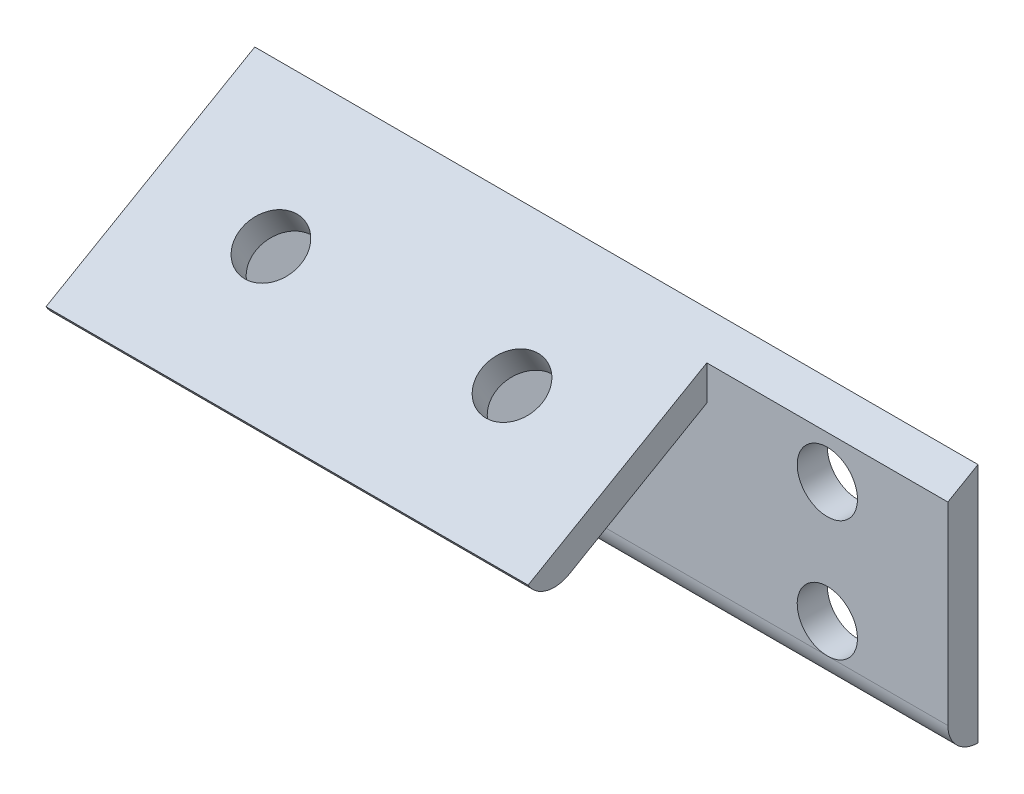
ISO-10303-21;
HEADER;
FILE_DESCRIPTION(('STEP AP214'),'2;1');
FILE_NAME('part.step','',(''),(''),'','','');
FILE_SCHEMA(('AUTOMOTIVE_DESIGN { 1 0 10303 214 1 1 1 1 }'));
ENDSEC;
DATA;
#1=APPLICATION_CONTEXT('core data for automotive mechanical design processes');
#2=APPLICATION_PROTOCOL_DEFINITION('international standard','automotive_design',2000,#1);
#3=PRODUCT_CONTEXT('',#1,'mechanical');
#4=PRODUCT('Part','Part','',(#3));
#5=PRODUCT_RELATED_PRODUCT_CATEGORY('part','',(#4));
#6=PRODUCT_DEFINITION_FORMATION('','',#4);
#7=PRODUCT_DEFINITION_CONTEXT('part definition',#1,'design');
#8=PRODUCT_DEFINITION('design','',#6,#7);
#9=PRODUCT_DEFINITION_SHAPE('','',#8);
#10=(LENGTH_UNIT() NAMED_UNIT(*) SI_UNIT(.MILLI.,.METRE.));
#11=(NAMED_UNIT(*) PLANE_ANGLE_UNIT() SI_UNIT($,.RADIAN.));
#12=(NAMED_UNIT(*) SI_UNIT($,.STERADIAN.) SOLID_ANGLE_UNIT());
#13=UNCERTAINTY_MEASURE_WITH_UNIT(LENGTH_MEASURE(1.E-05),#10,'distance_accuracy_value','');
#14=(GEOMETRIC_REPRESENTATION_CONTEXT(3) GLOBAL_UNCERTAINTY_ASSIGNED_CONTEXT((#13)) GLOBAL_UNIT_ASSIGNED_CONTEXT((#10,
#11,#12)) REPRESENTATION_CONTEXT('',''));
#15=CARTESIAN_POINT('',(0.,0.,0.));
#16=DIRECTION('',(0.,0.,1.));
#17=DIRECTION('',(1.,0.,0.));
#18=AXIS2_PLACEMENT_3D('',#15,#16,#17);
#19=CARTESIAN_POINT('',(76.2,0.,0.));
#20=DIRECTION('',(0.,-0.86602540378444,-0.499999999999998));
#21=DIRECTION('',(0.,0.499999999999998,-0.86602540378444));
#22=AXIS2_PLACEMENT_3D('',#19,#20,#21);
#23=PLANE('',#22);
#24=CARTESIAN_POINT('',(38.1,-6.34999999999997,10.9985226280624));
#25=DIRECTION('',(0.,0.86602540378444,0.499999999999998));
#26=DIRECTION('',(0.,-0.499999999999998,0.86602540378444));
#27=AXIS2_PLACEMENT_3D('',#24,#25,#26);
#28=CIRCLE('',#27,3.17499999999998);
#29=CARTESIAN_POINT('',(38.1,-7.93749999999996,13.748153285078));
#30=VERTEX_POINT('',#29);
#31=EDGE_CURVE('E197',#30,#30,#28,.T.);
#32=ORIENTED_EDGE('',*,*,#31,.F.);
#33=EDGE_LOOP('',(#32));
#34=FACE_BOUND('',#33,.T.);
#35=DIRECTION('',(-1.,0.,0.));
#36=VECTOR('',#35,1.);
#37=CARTESIAN_POINT('',(76.2,-12.6999999999999,21.9970452561248));
#38=LINE('',#37,#36);
#39=CARTESIAN_POINT('',(50.8,-12.6999999999999,21.9970452561248));
#40=VERTEX_POINT('',#39);
#41=CARTESIAN_POINT('',(0.,-12.6999999999999,21.9970452561248));
#42=VERTEX_POINT('',#41);
#43=EDGE_CURVE('E11',#40,#42,#38,.T.);
#44=ORIENTED_EDGE('',*,*,#43,.F.);
#45=DIRECTION('',(0.,-0.499999999999998,0.86602540378444));
#46=VECTOR('',#45,1.);
#47=CARTESIAN_POINT('',(50.8,-7.72506532850775,13.3802056407642));
#48=LINE('',#47,#46);
#49=CARTESIAN_POINT('',(50.8,-1.83308710467706,3.17499999999999));
#50=VERTEX_POINT('',#49);
#51=EDGE_CURVE('E117',#50,#40,#48,.T.);
#52=ORIENTED_EDGE('',*,*,#51,.F.);
#53=DIRECTION('',(-1.,0.,0.));
#54=VECTOR('',#53,1.);
#55=CARTESIAN_POINT('',(50.8,-1.83308710467705,3.17499999999999));
#56=LINE('',#55,#54);
#57=CARTESIAN_POINT('',(76.2,-1.83308710467706,3.175));
#58=VERTEX_POINT('',#57);
#59=EDGE_CURVE('E105',#58,#50,#56,.T.);
#60=ORIENTED_EDGE('',*,*,#59,.F.);
#61=DIRECTION('',(0.,-0.499999999999998,0.86602540378444));
#62=VECTOR('',#61,1.);
#63=CARTESIAN_POINT('',(76.2,0.,0.));
#64=LINE('',#63,#62);
#65=CARTESIAN_POINT('',(76.2,0.,0.));
#66=VERTEX_POINT('',#65);
#67=EDGE_CURVE('E111',#66,#58,#64,.T.);
#68=ORIENTED_EDGE('',*,*,#67,.F.);
#69=DIRECTION('',(-1.,0.,0.));
#70=VECTOR('',#69,1.);
#71=CARTESIAN_POINT('',(76.2,0.,0.));
#72=LINE('',#71,#70);
#73=CARTESIAN_POINT('',(0.,0.,0.));
#74=VERTEX_POINT('',#73);
#75=EDGE_CURVE('E130',#66,#74,#72,.T.);
#76=ORIENTED_EDGE('',*,*,#75,.T.);
#77=DIRECTION('',(0.,-0.499999999999998,0.86602540378444));
#78=VECTOR('',#77,1.);
#79=CARTESIAN_POINT('',(0.,0.,0.));
#80=LINE('',#79,#78);
#81=EDGE_CURVE('E131',#74,#42,#80,.T.);
#82=ORIENTED_EDGE('',*,*,#81,.T.);
#83=EDGE_LOOP('',(#44,#52,#60,#68,#76,#82));
#84=FACE_BOUND('',#83,.T.);
#85=CARTESIAN_POINT('',(12.7,-6.34999999999997,10.9985226280624));
#86=DIRECTION('',(0.,0.86602540378444,0.499999999999998));
#87=DIRECTION('',(0.,-0.499999999999998,0.86602540378444));
#88=AXIS2_PLACEMENT_3D('',#85,#86,#87);
#89=CIRCLE('',#88,3.17499999999999);
#90=CARTESIAN_POINT('',(12.7,-7.93749999999996,13.748153285078));
#91=VERTEX_POINT('',#90);
#92=EDGE_CURVE('E206',#91,#91,#89,.T.);
#93=ORIENTED_EDGE('',*,*,#92,.F.);
#94=EDGE_LOOP('',(#93));
#95=FACE_BOUND('',#94,.T.);
#96=ADVANCED_FACE('F35',(#34,#84,#95),#23,.F.);
#97=CARTESIAN_POINT('',(76.2,-5.49926131403117,3.175));
#98=DIRECTION('',(0.,0.,-1.));
#99=DIRECTION('',(0.,1.,0.));
#100=AXIS2_PLACEMENT_3D('',#97,#98,#99);
#101=PLANE('',#100);
#102=DIRECTION('',(-1.,0.,0.));
#103=VECTOR('',#102,1.);
#104=CARTESIAN_POINT('',(76.2,-22.225,3.175));
#105=LINE('',#104,#103);
#106=CARTESIAN_POINT('',(63.5,-22.225,3.175));
#107=VERTEX_POINT('',#106);
#108=CARTESIAN_POINT('',(0.,-22.225,3.175));
#109=VERTEX_POINT('',#108);
#110=EDGE_CURVE('E147',#107,#109,#105,.T.);
#111=ORIENTED_EDGE('',*,*,#110,.F.);
#112=CARTESIAN_POINT('',(63.5,-19.05,3.175));
#113=DIRECTION('',(0.,0.,1.));
#114=DIRECTION('',(1.,0.,0.));
#115=AXIS2_PLACEMENT_3D('',#112,#113,#114);
#116=CIRCLE('',#115,3.17499999999998);
#117=EDGE_CURVE('E47',#107,#107,#116,.T.);
#118=ORIENTED_EDGE('',*,*,#117,.F.);
#119=CARTESIAN_POINT('',(76.2,-22.225,3.175));
#120=VERTEX_POINT('',#119);
#121=EDGE_CURVE('E108',#120,#107,#105,.T.);
#122=ORIENTED_EDGE('',*,*,#121,.F.);
#123=DIRECTION('',(0.,-1.,0.));
#124=VECTOR('',#123,1.);
#125=CARTESIAN_POINT('',(76.2,-5.49926131403117,3.175));
#126=LINE('',#125,#124);
#127=EDGE_CURVE('E84',#58,#120,#126,.T.);
#128=ORIENTED_EDGE('',*,*,#127,.F.);
#129=ORIENTED_EDGE('',*,*,#59,.T.);
#130=DIRECTION('',(0.,1.,0.));
#131=VECTOR('',#130,1.);
#132=CARTESIAN_POINT('',(50.8,-25.401,3.17499999999999));
#133=LINE('',#132,#131);
#134=CARTESIAN_POINT('',(50.8,-5.49926131403117,3.17499999999999));
#135=VERTEX_POINT('',#134);
#136=EDGE_CURVE('E125',#135,#50,#133,.T.);
#137=ORIENTED_EDGE('',*,*,#136,.F.);
#138=DIRECTION('',(-1.,0.,0.));
#139=VECTOR('',#138,1.);
#140=CARTESIAN_POINT('',(76.2,-5.49926131403117,3.175));
#141=LINE('',#140,#139);
#142=CARTESIAN_POINT('',(0.,-5.49926131403117,3.175));
#143=VERTEX_POINT('',#142);
#144=EDGE_CURVE('E149',#135,#143,#141,.T.);
#145=ORIENTED_EDGE('',*,*,#144,.T.);
#146=DIRECTION('',(0.,-1.,0.));
#147=VECTOR('',#146,1.);
#148=CARTESIAN_POINT('',(0.,-5.49926131403117,3.175));
#149=LINE('',#148,#147);
#150=EDGE_CURVE('E140',#143,#109,#149,.T.);
#151=ORIENTED_EDGE('',*,*,#150,.T.);
#152=EDGE_LOOP('',(#111,#118,#122,#128,#129,#137,#145,#151));
#153=FACE_BOUND('',#152,.T.);
#154=CARTESIAN_POINT('',(63.5,-6.35,3.175));
#155=DIRECTION('',(0.,0.,1.));
#156=DIRECTION('',(1.,0.,0.));
#157=AXIS2_PLACEMENT_3D('',#154,#155,#156);
#158=CIRCLE('',#157,3.17499999999998);
#159=CARTESIAN_POINT('',(66.675,-6.35,3.175));
#160=VERTEX_POINT('',#159);
#161=EDGE_CURVE('E203',#160,#160,#158,.T.);
#162=ORIENTED_EDGE('',*,*,#161,.F.);
#163=EDGE_LOOP('',(#162));
#164=FACE_BOUND('',#163,.T.);
#165=ADVANCED_FACE('F103',(#153,#164),#101,.F.);
#166=CARTESIAN_POINT('',(76.2,-11.1125,19.2474145991092));
#167=DIRECTION('',(-1.,0.,0.));
#168=DIRECTION('',(0.,0.,1.));
#169=AXIS2_PLACEMENT_3D('',#166,#167,#168);
#170=CYLINDRICAL_SURFACE('',#169,3.175);
#171=DIRECTION('',(-1.,0.,0.));
#172=VECTOR('',#171,1.);
#173=CARTESIAN_POINT('',(76.2,-13.8621306570156,17.6599145991092));
#174=LINE('',#173,#172);
#175=CARTESIAN_POINT('',(50.8,-13.8621306570156,17.6599145991092));
#176=VERTEX_POINT('',#175);
#177=CARTESIAN_POINT('',(0.,-13.8621306570156,17.6599145991092));
#178=VERTEX_POINT('',#177);
#179=EDGE_CURVE('E42',#176,#178,#174,.T.);
#180=ORIENTED_EDGE('',*,*,#179,.F.);
#181=CARTESIAN_POINT('',(50.8,-11.1125,19.2474145991092));
#182=DIRECTION('',(-1.,0.,0.));
#183=DIRECTION('',(0.,0.,1.));
#184=AXIS2_PLACEMENT_3D('',#181,#182,#183);
#185=CIRCLE('',#184,3.175);
#186=EDGE_CURVE('E118',#40,#176,#185,.F.);
#187=ORIENTED_EDGE('',*,*,#186,.F.);
#188=ORIENTED_EDGE('',*,*,#43,.T.);
#189=CARTESIAN_POINT('',(0.,-11.1125,19.2474145991092));
#190=DIRECTION('',(1.,0.,0.));
#191=DIRECTION('',(0.,0.,-1.));
#192=AXIS2_PLACEMENT_3D('',#189,#190,#191);
#193=CIRCLE('',#192,3.175);
#194=EDGE_CURVE('E134',#42,#178,#193,.T.);
#195=ORIENTED_EDGE('',*,*,#194,.T.);
#196=EDGE_LOOP('',(#180,#187,#188,#195));
#197=FACE_BOUND('',#196,.T.);
#198=ADVANCED_FACE('F162',(#197),#170,.T.);
#199=CARTESIAN_POINT('',(76.2,-13.8621306570156,17.6599145991092));
#200=DIRECTION('',(0.,0.866025403784439,0.499999999999999));
#201=DIRECTION('',(0.,-0.499999999999999,0.86602540378444));
#202=AXIS2_PLACEMENT_3D('',#199,#200,#201);
#203=PLANE('',#202);
#204=CARTESIAN_POINT('',(12.7,-9.09963065701557,9.41102262806239));
#205=DIRECTION('',(0.,0.866025403784439,0.499999999999999));
#206=DIRECTION('',(0.,-0.499999999999999,0.86602540378444));
#207=AXIS2_PLACEMENT_3D('',#204,#205,#206);
#208=CIRCLE('',#207,3.17499999999999);
#209=CARTESIAN_POINT('',(12.7,-10.6871306570156,12.160653285078));
#210=VERTEX_POINT('',#209);
#211=EDGE_CURVE('E200',#210,#210,#208,.T.);
#212=ORIENTED_EDGE('',*,*,#211,.T.);
#213=EDGE_LOOP('',(#212));
#214=FACE_BOUND('',#213,.T.);
#215=CARTESIAN_POINT('',(38.1,-9.09963065701557,9.41102262806239));
#216=DIRECTION('',(0.,0.866025403784439,0.499999999999999));
#217=DIRECTION('',(0.,-0.499999999999999,0.86602540378444));
#218=AXIS2_PLACEMENT_3D('',#215,#216,#217);
#219=CIRCLE('',#218,3.17499999999999);
#220=CARTESIAN_POINT('',(38.1,-10.6871306570156,12.160653285078));
#221=VERTEX_POINT('',#220);
#222=EDGE_CURVE('E199',#221,#221,#219,.T.);
#223=ORIENTED_EDGE('',*,*,#222,.T.);
#224=EDGE_LOOP('',(#223));
#225=FACE_BOUND('',#224,.T.);
#226=ORIENTED_EDGE('',*,*,#144,.F.);
#227=DIRECTION('',(0.,0.499999999999999,-0.86602540378444));
#228=VECTOR('',#227,1.);
#229=CARTESIAN_POINT('',(50.8,-10.4746959855233,11.7927056407643));
#230=LINE('',#229,#228);
#231=EDGE_CURVE('E158',#176,#135,#230,.T.);
#232=ORIENTED_EDGE('',*,*,#231,.F.);
#233=ORIENTED_EDGE('',*,*,#179,.T.);
#234=DIRECTION('',(0.,0.499999999999999,-0.866025403784439));
#235=VECTOR('',#234,1.);
#236=CARTESIAN_POINT('',(0.,-13.8621306570156,17.6599145991092));
#237=LINE('',#236,#235);
#238=EDGE_CURVE('E137',#178,#143,#237,.T.);
#239=ORIENTED_EDGE('',*,*,#238,.T.);
#240=EDGE_LOOP('',(#226,#232,#233,#239));
#241=FACE_BOUND('',#240,.T.);
#242=ADVANCED_FACE('F154',(#214,#225,#241),#203,.F.);
#243=CARTESIAN_POINT('',(76.2,-22.225,0.));
#244=DIRECTION('',(-1.,0.,0.));
#245=DIRECTION('',(0.,0.,1.));
#246=AXIS2_PLACEMENT_3D('',#243,#244,#245);
#247=CYLINDRICAL_SURFACE('',#246,3.175);
#248=CARTESIAN_POINT('',(0.,-22.225,0.));
#249=DIRECTION('',(1.,0.,0.));
#250=DIRECTION('',(0.,0.,1.));
#251=AXIS2_PLACEMENT_3D('',#248,#249,#250);
#252=CIRCLE('',#251,3.175);
#253=CARTESIAN_POINT('',(0.,-25.4,0.));
#254=VERTEX_POINT('',#253);
#255=EDGE_CURVE('E122',#109,#254,#252,.T.);
#256=ORIENTED_EDGE('',*,*,#255,.T.);
#257=DIRECTION('',(-1.,0.,0.));
#258=VECTOR('',#257,1.);
#259=CARTESIAN_POINT('',(76.2,-25.4,0.));
#260=LINE('',#259,#258);
#261=CARTESIAN_POINT('',(76.2,-25.4,0.));
#262=VERTEX_POINT('',#261);
#263=EDGE_CURVE('E145',#262,#254,#260,.T.);
#264=ORIENTED_EDGE('',*,*,#263,.F.);
#265=CARTESIAN_POINT('',(76.2,-22.225,0.));
#266=DIRECTION('',(1.,0.,0.));
#267=DIRECTION('',(0.,0.,1.));
#268=AXIS2_PLACEMENT_3D('',#265,#266,#267);
#269=CIRCLE('',#268,3.175);
#270=EDGE_CURVE('E110',#120,#262,#269,.T.);
#271=ORIENTED_EDGE('',*,*,#270,.F.);
#272=ORIENTED_EDGE('',*,*,#121,.T.);
#273=ORIENTED_EDGE('',*,*,#110,.T.);
#274=EDGE_LOOP('',(#256,#264,#271,#272,#273));
#275=FACE_BOUND('',#274,.T.);
#276=ADVANCED_FACE('F178',(#275),#247,.T.);
#277=CARTESIAN_POINT('',(76.2,0.,0.));
#278=DIRECTION('',(0.,0.,1.));
#279=DIRECTION('',(0.,-1.,0.));
#280=AXIS2_PLACEMENT_3D('',#277,#278,#279);
#281=PLANE('',#280);
#282=CARTESIAN_POINT('',(63.5,-6.35,0.));
#283=DIRECTION('',(0.,0.,1.));
#284=DIRECTION('',(0.,-1.,0.));
#285=AXIS2_PLACEMENT_3D('',#282,#283,#284);
#286=CIRCLE('',#285,3.17499999999999);
#287=CARTESIAN_POINT('',(63.5,-9.52499999999999,0.));
#288=VERTEX_POINT('',#287);
#289=EDGE_CURVE('E212',#288,#288,#286,.T.);
#290=ORIENTED_EDGE('',*,*,#289,.T.);
#291=EDGE_LOOP('',(#290));
#292=FACE_BOUND('',#291,.T.);
#293=CARTESIAN_POINT('',(63.5,-19.05,0.));
#294=DIRECTION('',(0.,0.,1.));
#295=DIRECTION('',(0.,-1.,0.));
#296=AXIS2_PLACEMENT_3D('',#293,#294,#295);
#297=CIRCLE('',#296,3.17499999999999);
#298=CARTESIAN_POINT('',(63.5,-22.225,0.));
#299=VERTEX_POINT('',#298);
#300=EDGE_CURVE('E169',#299,#299,#297,.T.);
#301=ORIENTED_EDGE('',*,*,#300,.T.);
#302=EDGE_LOOP('',(#301));
#303=FACE_BOUND('',#302,.T.);
#304=DIRECTION('',(0.,1.,0.));
#305=VECTOR('',#304,1.);
#306=CARTESIAN_POINT('',(0.,0.,0.));
#307=LINE('',#306,#305);
#308=EDGE_CURVE('E80',#254,#74,#307,.T.);
#309=ORIENTED_EDGE('',*,*,#308,.T.);
#310=ORIENTED_EDGE('',*,*,#75,.F.);
#311=DIRECTION('',(0.,1.,0.));
#312=VECTOR('',#311,1.);
#313=CARTESIAN_POINT('',(76.2,0.,0.));
#314=LINE('',#313,#312);
#315=EDGE_CURVE('E55',#262,#66,#314,.T.);
#316=ORIENTED_EDGE('',*,*,#315,.F.);
#317=ORIENTED_EDGE('',*,*,#263,.T.);
#318=EDGE_LOOP('',(#309,#310,#316,#317));
#319=FACE_BOUND('',#318,.T.);
#320=ADVANCED_FACE('F175',(#292,#303,#319),#281,.F.);
#321=CARTESIAN_POINT('',(76.2,-11.1125,19.2474145991092));
#322=DIRECTION('',(1.,0.,0.));
#323=DIRECTION('',(0.,0.,-1.));
#324=AXIS2_PLACEMENT_3D('',#321,#322,#323);
#325=PLANE('',#324);
#326=ORIENTED_EDGE('',*,*,#67,.T.);
#327=ORIENTED_EDGE('',*,*,#127,.T.);
#328=ORIENTED_EDGE('',*,*,#270,.T.);
#329=ORIENTED_EDGE('',*,*,#315,.T.);
#330=EDGE_LOOP('',(#326,#327,#328,#329));
#331=FACE_BOUND('',#330,.T.);
#332=ADVANCED_FACE('F120',(#331),#325,.T.);
#333=CARTESIAN_POINT('',(0.,-11.1125,19.2474145991092));
#334=DIRECTION('',(1.,0.,0.));
#335=DIRECTION('',(0.,0.,-1.));
#336=AXIS2_PLACEMENT_3D('',#333,#334,#335);
#337=PLANE('',#336);
#338=ORIENTED_EDGE('',*,*,#81,.F.);
#339=ORIENTED_EDGE('',*,*,#308,.F.);
#340=ORIENTED_EDGE('',*,*,#255,.F.);
#341=ORIENTED_EDGE('',*,*,#150,.F.);
#342=ORIENTED_EDGE('',*,*,#238,.F.);
#343=ORIENTED_EDGE('',*,*,#194,.F.);
#344=EDGE_LOOP('',(#338,#339,#340,#341,#342,#343));
#345=FACE_BOUND('',#344,.T.);
#346=ADVANCED_FACE('F165',(#345),#337,.F.);
#347=CARTESIAN_POINT('',(50.8,-25.401,3.17499999999999));
#348=DIRECTION('',(-1.,0.,0.));
#349=DIRECTION('',(0.,0.,1.));
#350=AXIS2_PLACEMENT_3D('',#347,#348,#349);
#351=PLANE('',#350);
#352=ORIENTED_EDGE('',*,*,#51,.T.);
#353=ORIENTED_EDGE('',*,*,#186,.T.);
#354=ORIENTED_EDGE('',*,*,#231,.T.);
#355=ORIENTED_EDGE('',*,*,#136,.T.);
#356=EDGE_LOOP('',(#352,#353,#354,#355));
#357=FACE_BOUND('',#356,.T.);
#358=ADVANCED_FACE('F168',(#357),#351,.F.);
#359=CARTESIAN_POINT('',(63.5,-19.05,3.175));
#360=DIRECTION('',(0.,0.,1.));
#361=DIRECTION('',(1.,0.,0.));
#362=AXIS2_PLACEMENT_3D('',#359,#360,#361);
#363=CYLINDRICAL_SURFACE('',#362,3.17499999999999);
#364=ORIENTED_EDGE('',*,*,#300,.F.);
#365=EDGE_LOOP('',(#364));
#366=FACE_BOUND('',#365,.T.);
#367=ORIENTED_EDGE('',*,*,#117,.T.);
#368=EDGE_LOOP('',(#367));
#369=FACE_BOUND('',#368,.T.);
#370=ADVANCED_FACE('F221',(#366,#369),#363,.F.);
#371=CARTESIAN_POINT('',(63.5,-6.35,3.175));
#372=DIRECTION('',(0.,0.,1.));
#373=DIRECTION('',(1.,0.,0.));
#374=AXIS2_PLACEMENT_3D('',#371,#372,#373);
#375=CYLINDRICAL_SURFACE('',#374,3.17499999999999);
#376=ORIENTED_EDGE('',*,*,#289,.F.);
#377=EDGE_LOOP('',(#376));
#378=FACE_BOUND('',#377,.T.);
#379=ORIENTED_EDGE('',*,*,#161,.T.);
#380=EDGE_LOOP('',(#379));
#381=FACE_BOUND('',#380,.T.);
#382=ADVANCED_FACE('F217',(#378,#381),#375,.F.);
#383=CARTESIAN_POINT('',(38.1,-6.34999999999997,10.9985226280624));
#384=DIRECTION('',(0.,0.86602540378444,0.499999999999998));
#385=DIRECTION('',(0.,-0.499999999999998,0.86602540378444));
#386=AXIS2_PLACEMENT_3D('',#383,#384,#385);
#387=CYLINDRICAL_SURFACE('',#386,3.17499999999999);
#388=CARTESIAN_POINT('',(38.1,-10.6871306570156,12.160653285078));
#389=CARTESIAN_POINT('',(38.1,-10.658488671005,12.1771897434113));
#390=CARTESIAN_POINT('',(38.1,-10.6298466849944,12.1937262017446));
#391=CARTESIAN_POINT('',(38.1,-10.5725627129732,12.2267991184113));
#392=CARTESIAN_POINT('',(38.1,-10.5439207269627,12.2433355767446));
#393=CARTESIAN_POINT('',(38.1,-10.4866367549415,12.2764084934113));
#394=CARTESIAN_POINT('',(38.1,-10.4579947689309,12.2929449517446));
#395=CARTESIAN_POINT('',(38.1,-10.4007107969098,12.3260178684113));
#396=CARTESIAN_POINT('',(38.1,-10.3720688108992,12.3425543267446));
#397=CARTESIAN_POINT('',(38.1,-10.314784838878,12.3756272434113));
#398=CARTESIAN_POINT('',(38.1,-10.2861428528675,12.3921637017446));
#399=CARTESIAN_POINT('',(38.1,-10.2288588808463,12.4252366184113));
#400=CARTESIAN_POINT('',(38.1,-10.2002168948357,12.4417730767446));
#401=CARTESIAN_POINT('',(38.1,-10.1429329228146,12.4748459934113));
#402=CARTESIAN_POINT('',(38.1,-10.114290936804,12.4913824517446));
#403=CARTESIAN_POINT('',(38.1,-10.0570069647828,12.5244553684113));
#404=CARTESIAN_POINT('',(38.1,-10.0283649787722,12.5409918267446));
#405=CARTESIAN_POINT('',(38.1,-9.97108100675108,12.5740647434113));
#406=CARTESIAN_POINT('',(38.1,-9.9424390207405,12.5906012017446));
#407=CARTESIAN_POINT('',(38.1,-9.88515504871934,12.6236741184113));
#408=CARTESIAN_POINT('',(38.1,-9.85651306270877,12.6402105767446));
#409=CARTESIAN_POINT('',(38.1,-9.79922909068761,12.6732834934113));
#410=CARTESIAN_POINT('',(38.1,-9.77058710467703,12.6898199517446));
#411=CARTESIAN_POINT('',(38.1,-9.71330313265587,12.7228928684113));
#412=CARTESIAN_POINT('',(38.1,-9.68466114664529,12.7394293267446));
#413=CARTESIAN_POINT('',(38.1,-9.62737717462413,12.7725022434113));
#414=CARTESIAN_POINT('',(38.1,-9.59873518861355,12.7890387017446));
#415=CARTESIAN_POINT('',(38.1,-9.54145121659239,12.8221116184113));
#416=CARTESIAN_POINT('',(38.1,-9.51280923058182,12.8386480767446));
#417=CARTESIAN_POINT('',(38.1,-9.45552525856066,12.8717209934113));
#418=CARTESIAN_POINT('',(38.1,-9.42688327255008,12.8882574517446));
#419=CARTESIAN_POINT('',(38.1,-9.36959930052892,12.9213303684113));
#420=CARTESIAN_POINT('',(38.1,-9.34095731451834,12.9378668267446));
#421=CARTESIAN_POINT('',(38.1,-9.28367334249718,12.9709397434113));
#422=CARTESIAN_POINT('',(38.1,-9.2550313564866,12.9874762017446));
#423=CARTESIAN_POINT('',(38.1,-9.19774738446544,13.0205491184113));
#424=CARTESIAN_POINT('',(38.1,-9.16910539845487,13.0370855767446));
#425=CARTESIAN_POINT('',(38.1,-9.11182142643371,13.0701584934113));
#426=CARTESIAN_POINT('',(38.1,-9.08317944042313,13.0866949517446));
#427=CARTESIAN_POINT('',(38.1,-9.02589546840197,13.1197678684113));
#428=CARTESIAN_POINT('',(38.1,-8.99725348239139,13.1363043267446));
#429=CARTESIAN_POINT('',(38.1,-8.93996951037023,13.1693772434113));
#430=CARTESIAN_POINT('',(38.1,-8.91132752435965,13.1859137017446));
#431=CARTESIAN_POINT('',(38.1,-8.8540435523385,13.2189866184113));
#432=CARTESIAN_POINT('',(38.1,-8.82540156632792,13.2355230767446));
#433=CARTESIAN_POINT('',(38.1,-8.76811759430676,13.2685959934113));
#434=CARTESIAN_POINT('',(38.1,-8.73947560829618,13.2851324517446));
#435=CARTESIAN_POINT('',(38.1,-8.68219163627502,13.3182053684113));
#436=CARTESIAN_POINT('',(38.1,-8.65354965026444,13.3347418267446));
#437=CARTESIAN_POINT('',(38.1,-8.59626567824328,13.3678147434113));
#438=CARTESIAN_POINT('',(38.1,-8.5676236922327,13.3843512017446));
#439=CARTESIAN_POINT('',(38.1,-8.51033972021154,13.4174241184113));
#440=CARTESIAN_POINT('',(38.1,-8.48169773420097,13.4339605767446));
#441=CARTESIAN_POINT('',(38.1,-8.42441376217981,13.4670334934113));
#442=CARTESIAN_POINT('',(38.1,-8.39577177616923,13.4835699517446));
#443=CARTESIAN_POINT('',(38.1,-8.33848780414807,13.5166428684113));
#444=CARTESIAN_POINT('',(38.1,-8.30984581813749,13.5331793267446));
#445=CARTESIAN_POINT('',(38.1,-8.25256184611633,13.5662522434113));
#446=CARTESIAN_POINT('',(38.1,-8.22391986010575,13.5827887017446));
#447=CARTESIAN_POINT('',(38.1,-8.16663588808459,13.6158616184113));
#448=CARTESIAN_POINT('',(38.1,-8.13799390207402,13.6323980767446));
#449=CARTESIAN_POINT('',(38.1,-8.08070993005286,13.6654709934113));
#450=CARTESIAN_POINT('',(38.1,-8.05206794404228,13.6820074517446));
#451=CARTESIAN_POINT('',(38.1,-7.99478397202112,13.7150803684113));
#452=CARTESIAN_POINT('',(38.1,-7.96614198601054,13.7316168267446));
#453=CARTESIAN_POINT('',(38.1,-7.93749999999996,13.748153285078));
#454=B_SPLINE_CURVE_WITH_KNOTS('',3,(#388,#389,#390,#391,#392,#393,#394,#395,#396,#397,#398,
#399,#400,#401,#402,#403,#404,#405,#406,#407,#408,#409,#410,#411,#412,#413,#414,#415,#416,#417,
#418,#419,#420,#421,#422,#423,#424,#425,#426,#427,#428,#429,#430,#431,#432,#433,#434,#435,#436,
#437,#438,#439,#440,#441,#442,#443,#444,#445,#446,#447,#448,#449,#450,#451,#452,#453),
.UNSPECIFIED.,.F.,.F.,(4,2,2,2,2,2,2,2,2,2,2,2,2,2,2,2,2,2,2,2,2,2,2,2,2,2,2,2,2,2,2,2,4),(0.,
0.09921875,0.198437499999999,0.297656249999999,0.396875,0.496093750000001,0.595312500000001,
0.694531250000001,0.79375,0.892968750000001,0.992187500000001,1.09140625,1.190625,1.28984375,
1.3890625,1.48828125,1.5875,1.68671875,1.7859375,1.88515625,1.984375,2.08359375,2.1828125,
2.28203125,2.38125,2.48046875,2.5796875,2.67890625,2.778125,2.87734375,2.9765625,3.07578125,
3.175),.UNSPECIFIED.);
#455=EDGE_CURVE('BSEAM220',#221,#30,#454,.T.);
#456=ORIENTED_EDGE('',*,*,#222,.F.);
#457=ORIENTED_EDGE('',*,*,#31,.T.);
#458=ORIENTED_EDGE('',*,*,#455,.T.);
#459=ORIENTED_EDGE('',*,*,#455,.F.);
#460=EDGE_LOOP('',(#456,#458,#457,#459));
#461=FACE_BOUND('',#460,.T.);
#462=ADVANCED_FACE('F220',(#461),#387,.F.);
#463=CARTESIAN_POINT('',(12.7,-6.34999999999997,10.9985226280624));
#464=DIRECTION('',(0.,0.86602540378444,0.499999999999998));
#465=DIRECTION('',(0.,-0.499999999999998,0.86602540378444));
#466=AXIS2_PLACEMENT_3D('',#463,#464,#465);
#467=CYLINDRICAL_SURFACE('',#466,3.17499999999999);
#468=CARTESIAN_POINT('',(12.7,-10.6871306570156,12.160653285078));
#469=CARTESIAN_POINT('',(12.7,-10.658488671005,12.1771897434113));
#470=CARTESIAN_POINT('',(12.7,-10.6298466849944,12.1937262017446));
#471=CARTESIAN_POINT('',(12.7,-10.5725627129732,12.2267991184113));
#472=CARTESIAN_POINT('',(12.7,-10.5439207269627,12.2433355767446));
#473=CARTESIAN_POINT('',(12.7,-10.4866367549415,12.2764084934113));
#474=CARTESIAN_POINT('',(12.7,-10.4579947689309,12.2929449517446));
#475=CARTESIAN_POINT('',(12.7,-10.4007107969098,12.3260178684113));
#476=CARTESIAN_POINT('',(12.7,-10.3720688108992,12.3425543267446));
#477=CARTESIAN_POINT('',(12.7,-10.314784838878,12.3756272434113));
#478=CARTESIAN_POINT('',(12.7,-10.2861428528675,12.3921637017446));
#479=CARTESIAN_POINT('',(12.7,-10.2288588808463,12.4252366184113));
#480=CARTESIAN_POINT('',(12.7,-10.2002168948357,12.4417730767446));
#481=CARTESIAN_POINT('',(12.7,-10.1429329228146,12.4748459934113));
#482=CARTESIAN_POINT('',(12.7,-10.114290936804,12.4913824517446));
#483=CARTESIAN_POINT('',(12.7,-10.0570069647828,12.5244553684113));
#484=CARTESIAN_POINT('',(12.7,-10.0283649787722,12.5409918267446));
#485=CARTESIAN_POINT('',(12.7,-9.97108100675108,12.5740647434113));
#486=CARTESIAN_POINT('',(12.7,-9.94243902074051,12.5906012017446));
#487=CARTESIAN_POINT('',(12.7,-9.88515504871935,12.6236741184113));
#488=CARTESIAN_POINT('',(12.7,-9.85651306270877,12.6402105767446));
#489=CARTESIAN_POINT('',(12.7,-9.79922909068761,12.6732834934113));
#490=CARTESIAN_POINT('',(12.7,-9.77058710467703,12.6898199517446));
#491=CARTESIAN_POINT('',(12.7,-9.71330313265587,12.7228928684113));
#492=CARTESIAN_POINT('',(12.7,-9.68466114664529,12.7394293267446));
#493=CARTESIAN_POINT('',(12.7,-9.62737717462413,12.7725022434113));
#494=CARTESIAN_POINT('',(12.7,-9.59873518861356,12.7890387017446));
#495=CARTESIAN_POINT('',(12.7,-9.5414512165924,12.8221116184113));
#496=CARTESIAN_POINT('',(12.7,-9.51280923058182,12.8386480767446));
#497=CARTESIAN_POINT('',(12.7,-9.45552525856066,12.8717209934113));
#498=CARTESIAN_POINT('',(12.7,-9.42688327255008,12.8882574517446));
#499=CARTESIAN_POINT('',(12.7,-9.36959930052892,12.9213303684113));
#500=CARTESIAN_POINT('',(12.7,-9.34095731451834,12.9378668267446));
#501=CARTESIAN_POINT('',(12.7,-9.28367334249718,12.9709397434113));
#502=CARTESIAN_POINT('',(12.7,-9.25503135648661,12.9874762017446));
#503=CARTESIAN_POINT('',(12.7,-9.19774738446545,13.0205491184113));
#504=CARTESIAN_POINT('',(12.7,-9.16910539845487,13.0370855767446));
#505=CARTESIAN_POINT('',(12.7,-9.11182142643371,13.0701584934113));
#506=CARTESIAN_POINT('',(12.7,-9.08317944042313,13.0866949517446));
#507=CARTESIAN_POINT('',(12.7,-9.02589546840197,13.1197678684113));
#508=CARTESIAN_POINT('',(12.7,-8.99725348239139,13.1363043267446));
#509=CARTESIAN_POINT('',(12.7,-8.93996951037023,13.1693772434113));
#510=CARTESIAN_POINT('',(12.7,-8.91132752435965,13.1859137017446));
#511=CARTESIAN_POINT('',(12.7,-8.8540435523385,13.2189866184113));
#512=CARTESIAN_POINT('',(12.7,-8.82540156632792,13.2355230767446));
#513=CARTESIAN_POINT('',(12.7,-8.76811759430676,13.2685959934113));
#514=CARTESIAN_POINT('',(12.7,-8.73947560829618,13.2851324517446));
#515=CARTESIAN_POINT('',(12.7,-8.68219163627502,13.3182053684113));
#516=CARTESIAN_POINT('',(12.7,-8.65354965026444,13.3347418267446));
#517=CARTESIAN_POINT('',(12.7,-8.59626567824328,13.3678147434113));
#518=CARTESIAN_POINT('',(12.7,-8.5676236922327,13.3843512017446));
#519=CARTESIAN_POINT('',(12.7,-8.51033972021155,13.4174241184113));
#520=CARTESIAN_POINT('',(12.7,-8.48169773420097,13.4339605767446));
#521=CARTESIAN_POINT('',(12.7,-8.42441376217981,13.4670334934113));
#522=CARTESIAN_POINT('',(12.7,-8.39577177616923,13.4835699517446));
#523=CARTESIAN_POINT('',(12.7,-8.33848780414807,13.5166428684113));
#524=CARTESIAN_POINT('',(12.7,-8.30984581813749,13.5331793267446));
#525=CARTESIAN_POINT('',(12.7,-8.25256184611633,13.5662522434113));
#526=CARTESIAN_POINT('',(12.7,-8.22391986010576,13.5827887017446));
#527=CARTESIAN_POINT('',(12.7,-8.1666358880846,13.6158616184113));
#528=CARTESIAN_POINT('',(12.7,-8.13799390207402,13.6323980767446));
#529=CARTESIAN_POINT('',(12.7,-8.08070993005286,13.6654709934113));
#530=CARTESIAN_POINT('',(12.7,-8.05206794404228,13.6820074517446));
#531=CARTESIAN_POINT('',(12.7,-7.99478397202112,13.7150803684113));
#532=CARTESIAN_POINT('',(12.7,-7.96614198601054,13.7316168267446));
#533=CARTESIAN_POINT('',(12.7,-7.93749999999996,13.748153285078));
#534=B_SPLINE_CURVE_WITH_KNOTS('',3,(#468,#469,#470,#471,#472,#473,#474,#475,#476,#477,#478,
#479,#480,#481,#482,#483,#484,#485,#486,#487,#488,#489,#490,#491,#492,#493,#494,#495,#496,#497,
#498,#499,#500,#501,#502,#503,#504,#505,#506,#507,#508,#509,#510,#511,#512,#513,#514,#515,#516,
#517,#518,#519,#520,#521,#522,#523,#524,#525,#526,#527,#528,#529,#530,#531,#532,#533),
.UNSPECIFIED.,.F.,.F.,(4,2,2,2,2,2,2,2,2,2,2,2,2,2,2,2,2,2,2,2,2,2,2,2,2,2,2,2,2,2,2,2,4),(0.,
0.0992187500000008,0.198437499999999,0.29765625,0.396875,0.496093749999999,0.595312499999999,
0.69453125,0.793750000000001,0.892968750000001,0.992187500000002,1.09140625,1.190625,1.28984375,
1.3890625,1.48828125,1.5875,1.68671875,1.7859375,1.88515625,1.984375,2.08359375,2.1828125,
2.28203125,2.38125,2.48046875,2.5796875,2.67890625,2.778125,2.87734375,2.9765625,3.07578125,
3.17500000000001),.UNSPECIFIED.);
#535=EDGE_CURVE('BSEAM228',#210,#91,#534,.T.);
#536=ORIENTED_EDGE('',*,*,#211,.F.);
#537=ORIENTED_EDGE('',*,*,#92,.T.);
#538=ORIENTED_EDGE('',*,*,#535,.T.);
#539=ORIENTED_EDGE('',*,*,#535,.F.);
#540=EDGE_LOOP('',(#536,#538,#537,#539));
#541=FACE_BOUND('',#540,.T.);
#542=ADVANCED_FACE('F228',(#541),#467,.F.);
#543=CLOSED_SHELL('',(#96,#165,#198,#242,#276,#320,#332,#346,#358,#370,#382,#462,#542));
#544=MANIFOLD_SOLID_BREP('B2',#543);
#545=ADVANCED_BREP_SHAPE_REPRESENTATION('',(#18,#544),#14);
#546=SHAPE_DEFINITION_REPRESENTATION(#9,#545);
ENDSEC;
END-ISO-10303-21;
